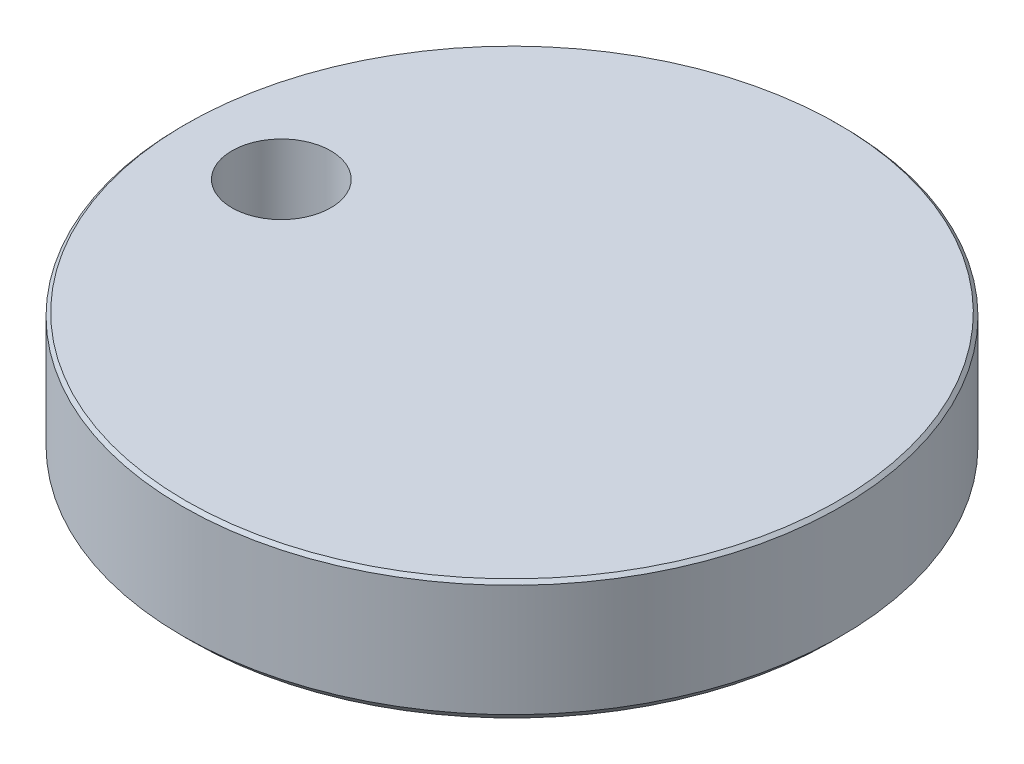
ISO-10303-21;
HEADER;
FILE_DESCRIPTION(('STEP AP214'),'2;1');
FILE_NAME('part.step','',(''),(''),'','','');
FILE_SCHEMA(('AUTOMOTIVE_DESIGN { 1 0 10303 214 1 1 1 1 }'));
ENDSEC;
DATA;
#1=APPLICATION_CONTEXT('core data for automotive mechanical design processes');
#2=APPLICATION_PROTOCOL_DEFINITION('international standard','automotive_design',2000,#1);
#3=PRODUCT_CONTEXT('',#1,'mechanical');
#4=PRODUCT('Part','Part','',(#3));
#5=PRODUCT_RELATED_PRODUCT_CATEGORY('part','',(#4));
#6=PRODUCT_DEFINITION_FORMATION('','',#4);
#7=PRODUCT_DEFINITION_CONTEXT('part definition',#1,'design');
#8=PRODUCT_DEFINITION('design','',#6,#7);
#9=PRODUCT_DEFINITION_SHAPE('','',#8);
#10=(LENGTH_UNIT() NAMED_UNIT(*) SI_UNIT(.MILLI.,.METRE.));
#11=(NAMED_UNIT(*) PLANE_ANGLE_UNIT() SI_UNIT($,.RADIAN.));
#12=(NAMED_UNIT(*) SI_UNIT($,.STERADIAN.) SOLID_ANGLE_UNIT());
#13=UNCERTAINTY_MEASURE_WITH_UNIT(LENGTH_MEASURE(1.E-05),#10,'distance_accuracy_value','');
#14=(GEOMETRIC_REPRESENTATION_CONTEXT(3) GLOBAL_UNCERTAINTY_ASSIGNED_CONTEXT((#13)) GLOBAL_UNIT_ASSIGNED_CONTEXT((#10,
#11,#12)) REPRESENTATION_CONTEXT('',''));
#15=CARTESIAN_POINT('',(0.,0.,0.));
#16=DIRECTION('',(0.,0.,1.));
#17=DIRECTION('',(1.,0.,0.));
#18=AXIS2_PLACEMENT_3D('',#15,#16,#17);
#19=CARTESIAN_POINT('',(-7.,3.8,0.));
#20=DIRECTION('',(0.,-1.,0.));
#21=DIRECTION('',(1.,0.,0.));
#22=AXIS2_PLACEMENT_3D('',#19,#20,#21);
#23=CYLINDRICAL_SURFACE('',#22,1.5);
#24=CARTESIAN_POINT('',(-7.,3.8,0.));
#25=DIRECTION('',(0.,-1.,0.));
#26=DIRECTION('',(-1.,0.,0.));
#27=AXIS2_PLACEMENT_3D('',#24,#25,#26);
#28=CIRCLE('',#27,1.5);
#29=CARTESIAN_POINT('',(-8.5,3.8,0.));
#30=VERTEX_POINT('',#29);
#31=EDGE_CURVE('E77',#30,#30,#28,.T.);
#32=ORIENTED_EDGE('',*,*,#31,.F.);
#33=DIRECTION('',(0.,-1.,0.));
#34=VECTOR('',#33,1.);
#35=CARTESIAN_POINT('',(-8.5,3.8,0.));
#36=LINE('',#35,#34);
#37=CARTESIAN_POINT('',(-8.5,0.,0.));
#38=VERTEX_POINT('',#37);
#39=EDGE_CURVE('E11',#30,#38,#36,.T.);
#40=ORIENTED_EDGE('',*,*,#39,.T.);
#41=CARTESIAN_POINT('',(-7.,0.,0.));
#42=DIRECTION('',(0.,-1.,0.));
#43=DIRECTION('',(-1.,0.,0.));
#44=AXIS2_PLACEMENT_3D('',#41,#42,#43);
#45=CIRCLE('',#44,1.5);
#46=EDGE_CURVE('E28',#38,#38,#45,.T.);
#47=ORIENTED_EDGE('',*,*,#46,.T.);
#48=ORIENTED_EDGE('',*,*,#39,.F.);
#49=EDGE_LOOP('',(#32,#40,#47,#48));
#50=FACE_BOUND('',#49,.T.);
#51=ADVANCED_FACE('F17',(#50),#23,.F.);
#52=CARTESIAN_POINT('',(0.,0.,0.));
#53=DIRECTION('',(0.,1.,0.));
#54=DIRECTION('',(1.,0.,0.));
#55=AXIS2_PLACEMENT_3D('',#52,#53,#54);
#56=PLANE('',#55);
#57=ORIENTED_EDGE('',*,*,#46,.F.);
#58=EDGE_LOOP('',(#57));
#59=FACE_BOUND('',#58,.T.);
#60=CARTESIAN_POINT('',(0.,3.599049538394E-07,0.));
#61=DIRECTION('',(0.,1.,0.));
#62=DIRECTION('',(-1.,0.,0.));
#63=AXIS2_PLACEMENT_3D('',#60,#61,#62);
#64=CIRCLE('',#63,9.699998975724);
#65=CARTESIAN_POINT('',(0.,3.59904559071866E-07,9.69999897572439));
#66=VERTEX_POINT('',#65);
#67=EDGE_CURVE('E95',#66,#66,#64,.T.);
#68=ORIENTED_EDGE('',*,*,#67,.F.);
#69=EDGE_LOOP('',(#68));
#70=FACE_BOUND('',#69,.T.);
#71=ADVANCED_FACE('F191',(#59,#70),#56,.F.);
#72=CARTESIAN_POINT('',(0.,0.1500007932131,0.));
#73=DIRECTION('',(0.,1.,0.));
#74=DIRECTION('',(0.,0.,-1.));
#75=AXIS2_PLACEMENT_3D('',#72,#73,#74);
#76=CONICAL_SURFACE('',#75,9.849999387628,0.785398092047865);
#77=CARTESIAN_POINT('',(0.,0.3000006911946,0.));
#78=DIRECTION('',(0.,1.,0.));
#79=DIRECTION('',(1.,0.,0.));
#80=AXIS2_PLACEMENT_3D('',#77,#78,#79);
#81=CIRCLE('',#80,10.);
#82=CARTESIAN_POINT('',(-10.,0.3000006911946,0.));
#83=VERTEX_POINT('',#82);
#84=CARTESIAN_POINT('',(0.,0.300001059092287,9.99999963210228));
#85=VERTEX_POINT('',#84);
#86=EDGE_CURVE('E88',#83,#85,#81,.T.);
#87=ORIENTED_EDGE('',*,*,#86,.F.);
#88=CARTESIAN_POINT('',(0.,0.3000006911946,0.));
#89=DIRECTION('',(0.,1.,0.));
#90=DIRECTION('',(1.,0.,0.));
#91=AXIS2_PLACEMENT_3D('',#88,#89,#90);
#92=CIRCLE('',#91,10.);
#93=EDGE_CURVE('E91',#85,#83,#92,.T.);
#94=ORIENTED_EDGE('',*,*,#93,.F.);
#95=DIRECTION('',(0.,-0.70710683163832,-0.707106730734771));
#96=VECTOR('',#95,1.);
#97=CARTESIAN_POINT('',(0.,0.1500007932131,9.849999387628));
#98=LINE('',#97,#96);
#99=EDGE_CURVE('E21',#85,#66,#98,.T.);
#100=ORIENTED_EDGE('',*,*,#99,.T.);
#101=ORIENTED_EDGE('',*,*,#67,.T.);
#102=ORIENTED_EDGE('',*,*,#99,.F.);
#103=EDGE_LOOP('',(#87,#94,#100,#101,#102));
#104=FACE_BOUND('',#103,.T.);
#105=ADVANCED_FACE('F19',(#104),#76,.T.);
#106=CARTESIAN_POINT('',(0.,-0.19,0.));
#107=DIRECTION('',(0.,1.,0.));
#108=DIRECTION('',(1.,0.,0.));
#109=AXIS2_PLACEMENT_3D('',#106,#107,#108);
#110=CYLINDRICAL_SURFACE('',#109,10.);
#111=CARTESIAN_POINT('',(0.,3.699999110398,0.));
#112=DIRECTION('',(0.,1.,0.));
#113=DIRECTION('',(-1.,0.,0.));
#114=AXIS2_PLACEMENT_3D('',#111,#112,#113);
#115=CIRCLE('',#114,10.);
#116=CARTESIAN_POINT('',(-1.26178887362603E-13,3.69999898020391,9.99999986980596));
#117=VERTEX_POINT('',#116);
#118=CARTESIAN_POINT('',(-10.,3.699999110398,0.));
#119=VERTEX_POINT('',#118);
#120=EDGE_CURVE('E83',#117,#119,#115,.T.);
#121=ORIENTED_EDGE('',*,*,#120,.F.);
#122=CARTESIAN_POINT('',(0.,3.699999110398,0.));
#123=DIRECTION('',(0.,1.,0.));
#124=DIRECTION('',(-1.,0.,0.));
#125=AXIS2_PLACEMENT_3D('',#122,#123,#124);
#126=CIRCLE('',#125,10.);
#127=EDGE_CURVE('E69',#119,#117,#126,.T.);
#128=ORIENTED_EDGE('',*,*,#127,.F.);
#129=DIRECTION('',(0.,-1.,0.));
#130=VECTOR('',#129,1.);
#131=CARTESIAN_POINT('',(-10.,-0.19,0.));
#132=LINE('',#131,#130);
#133=EDGE_CURVE('E72',#119,#83,#132,.T.);
#134=ORIENTED_EDGE('',*,*,#133,.T.);
#135=ORIENTED_EDGE('',*,*,#86,.T.);
#136=ORIENTED_EDGE('',*,*,#93,.T.);
#137=ORIENTED_EDGE('',*,*,#133,.F.);
#138=EDGE_LOOP('',(#121,#128,#134,#135,#136,#137));
#139=FACE_BOUND('',#138,.T.);
#140=ADVANCED_FACE('F108',(#139),#110,.T.);
#141=CARTESIAN_POINT('',(-1.249542405794E-13,3.749999366616,-1.312283615107E-13));
#142=DIRECTION('',(0.,-1.,0.));
#143=DIRECTION('',(0.,0.,-1.));
#144=AXIS2_PLACEMENT_3D('',#141,#142,#143);
#145=CONICAL_SURFACE('',#144,9.949999489144,0.785398105897925);
#146=ORIENTED_EDGE('',*,*,#120,.T.);
#147=ORIENTED_EDGE('',*,*,#127,.T.);
#148=DIRECTION('',(0.,0.707106821844849,-0.707106740528244));
#149=VECTOR('',#148,1.);
#150=CARTESIAN_POINT('',(-1.2617276408199E-13,3.749999366616,9.94999948914387));
#151=LINE('',#150,#149);
#152=CARTESIAN_POINT('',(-1.26166640787403E-13,3.79999986712701,9.89999899438287));
#153=VERTEX_POINT('',#152);
#154=EDGE_CURVE('E55',#117,#153,#151,.T.);
#155=ORIENTED_EDGE('',*,*,#154,.T.);
#156=CARTESIAN_POINT('',(-1.249511789317E-13,3.799999867127,-1.312283615107E-13));
#157=DIRECTION('',(0.,1.,0.));
#158=DIRECTION('',(-1.,0.,0.));
#159=AXIS2_PLACEMENT_3D('',#156,#157,#158);
#160=CIRCLE('',#159,9.899998994383);
#161=EDGE_CURVE('E67',#153,#153,#160,.T.);
#162=ORIENTED_EDGE('',*,*,#161,.F.);
#163=ORIENTED_EDGE('',*,*,#154,.F.);
#164=EDGE_LOOP('',(#146,#147,#155,#162,#163));
#165=FACE_BOUND('',#164,.T.);
#166=ADVANCED_FACE('F66',(#165),#145,.T.);
#167=CARTESIAN_POINT('',(0.,3.8,0.));
#168=DIRECTION('',(0.,1.,0.));
#169=DIRECTION('',(1.,0.,0.));
#170=AXIS2_PLACEMENT_3D('',#167,#168,#169);
#171=PLANE('',#170);
#172=ORIENTED_EDGE('',*,*,#31,.T.);
#173=EDGE_LOOP('',(#172));
#174=FACE_BOUND('',#173,.T.);
#175=ORIENTED_EDGE('',*,*,#161,.T.);
#176=EDGE_LOOP('',(#175));
#177=FACE_BOUND('',#176,.T.);
#178=ADVANCED_FACE('F75',(#174,#177),#171,.T.);
#179=CLOSED_SHELL('',(#51,#71,#105,#140,#166,#178));
#180=MANIFOLD_SOLID_BREP('B1',#179);
#181=ADVANCED_BREP_SHAPE_REPRESENTATION('',(#18,#180),#14);
#182=SHAPE_DEFINITION_REPRESENTATION(#9,#181);
ENDSEC;
END-ISO-10303-21;
